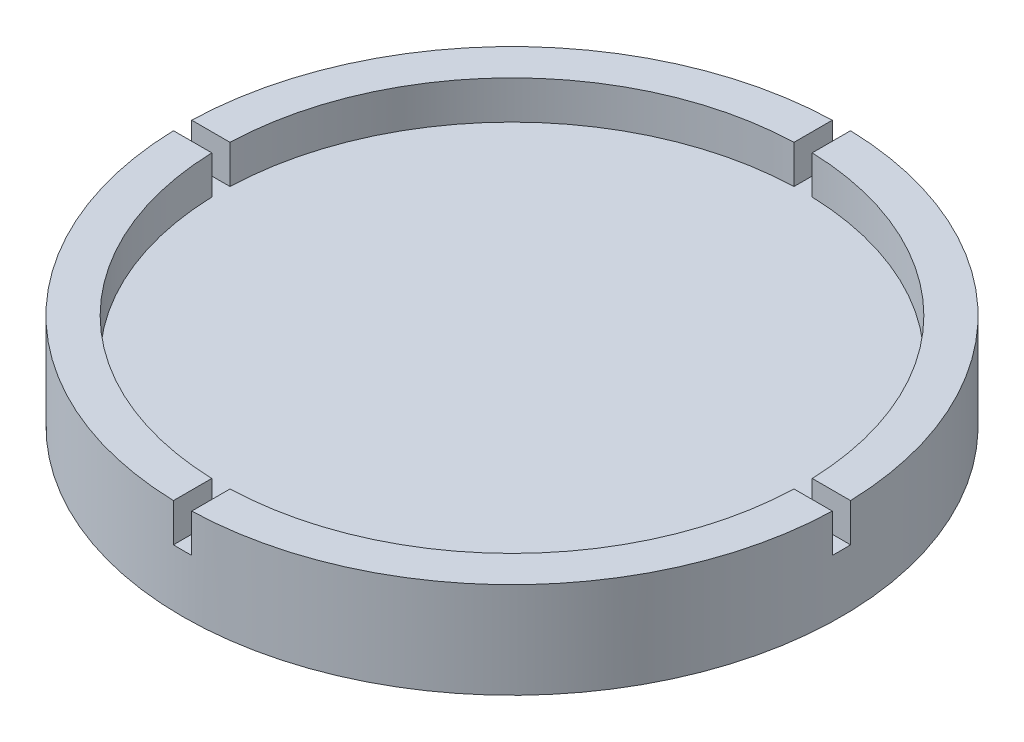
ISO-10303-21;
HEADER;
FILE_DESCRIPTION(('STEP AP214'),'2;1');
FILE_NAME('part.step','',(''),(''),'','','');
FILE_SCHEMA(('AUTOMOTIVE_DESIGN { 1 0 10303 214 1 1 1 1 }'));
ENDSEC;
DATA;
#1=APPLICATION_CONTEXT('core data for automotive mechanical design processes');
#2=APPLICATION_PROTOCOL_DEFINITION('international standard','automotive_design',2000,#1);
#3=PRODUCT_CONTEXT('',#1,'mechanical');
#4=PRODUCT('Part','Part','',(#3));
#5=PRODUCT_RELATED_PRODUCT_CATEGORY('part','',(#4));
#6=PRODUCT_DEFINITION_FORMATION('','',#4);
#7=PRODUCT_DEFINITION_CONTEXT('part definition',#1,'design');
#8=PRODUCT_DEFINITION('design','',#6,#7);
#9=PRODUCT_DEFINITION_SHAPE('','',#8);
#10=(LENGTH_UNIT() NAMED_UNIT(*) SI_UNIT(.MILLI.,.METRE.));
#11=(NAMED_UNIT(*) PLANE_ANGLE_UNIT() SI_UNIT($,.RADIAN.));
#12=(NAMED_UNIT(*) SI_UNIT($,.STERADIAN.) SOLID_ANGLE_UNIT());
#13=UNCERTAINTY_MEASURE_WITH_UNIT(LENGTH_MEASURE(1.E-05),#10,'distance_accuracy_value','');
#14=(GEOMETRIC_REPRESENTATION_CONTEXT(3) GLOBAL_UNCERTAINTY_ASSIGNED_CONTEXT((#13)) GLOBAL_UNIT_ASSIGNED_CONTEXT((#10,
#11,#12)) REPRESENTATION_CONTEXT('',''));
#15=CARTESIAN_POINT('',(0.,0.,0.));
#16=DIRECTION('',(0.,0.,1.));
#17=DIRECTION('',(1.,0.,0.));
#18=AXIS2_PLACEMENT_3D('',#15,#16,#17);
#19=CARTESIAN_POINT('',(0.,25.,0.));
#20=DIRECTION('',(0.,-1.,0.));
#21=DIRECTION('',(0.,0.,-1.));
#22=AXIS2_PLACEMENT_3D('',#19,#20,#21);
#23=PLANE('',#22);
#24=CARTESIAN_POINT('',(0.,25.,0.));
#25=DIRECTION('',(0.,-1.,0.));
#26=DIRECTION('',(0.,0.,-1.));
#27=AXIS2_PLACEMENT_3D('',#24,#25,#26);
#28=CIRCLE('',#27,86.);
#29=CARTESIAN_POINT('',(2.38,25.,-85.9670611339017));
#30=VERTEX_POINT('',#29);
#31=CARTESIAN_POINT('',(85.9670611339017,25.,-2.38));
#32=VERTEX_POINT('',#31);
#33=EDGE_CURVE('E177',#30,#32,#28,.T.);
#34=ORIENTED_EDGE('',*,*,#33,.F.);
#35=DIRECTION('',(0.,0.,-1.));
#36=VECTOR('',#35,1.);
#37=CARTESIAN_POINT('',(2.38,25.,-86.));
#38=LINE('',#37,#36);
#39=CARTESIAN_POINT('',(2.38,25.,-75.9627250696024));
#40=VERTEX_POINT('',#39);
#41=EDGE_CURVE('E327',#40,#30,#38,.T.);
#42=ORIENTED_EDGE('',*,*,#41,.F.);
#43=CARTESIAN_POINT('',(0.,25.,0.));
#44=DIRECTION('',(0.,-1.,0.));
#45=DIRECTION('',(0.,0.,-1.));
#46=AXIS2_PLACEMENT_3D('',#43,#44,#45);
#47=CIRCLE('',#46,76.);
#48=CARTESIAN_POINT('',(75.9627250696024,25.,-2.38));
#49=VERTEX_POINT('',#48);
#50=EDGE_CURVE('E179',#40,#49,#47,.T.);
#51=ORIENTED_EDGE('',*,*,#50,.T.);
#52=DIRECTION('',(-1.,0.,0.));
#53=VECTOR('',#52,1.);
#54=CARTESIAN_POINT('',(86.,25.,-2.38));
#55=LINE('',#54,#53);
#56=EDGE_CURVE('E164',#32,#49,#55,.T.);
#57=ORIENTED_EDGE('',*,*,#56,.F.);
#58=EDGE_LOOP('',(#34,#42,#51,#57));
#59=FACE_BOUND('',#58,.T.);
#60=ADVANCED_FACE('F45',(#59),#23,.F.);
#61=CARTESIAN_POINT('',(-2.37999999999998,25.,85.9670611339017));
#62=VERTEX_POINT('',#61);
#63=CARTESIAN_POINT('',(-85.9670611339017,25.,2.38));
#64=VERTEX_POINT('',#63);
#65=EDGE_CURVE('E200',#62,#64,#28,.T.);
#66=ORIENTED_EDGE('',*,*,#65,.F.);
#67=DIRECTION('',(0.,0.,1.));
#68=VECTOR('',#67,1.);
#69=CARTESIAN_POINT('',(-2.37999999999998,25.,74.8175510394926));
#70=LINE('',#69,#68);
#71=CARTESIAN_POINT('',(-2.37999999999998,25.,75.9627250696024));
#72=VERTEX_POINT('',#71);
#73=EDGE_CURVE('E318',#72,#62,#70,.T.);
#74=ORIENTED_EDGE('',*,*,#73,.F.);
#75=CARTESIAN_POINT('',(-75.9627250696024,25.,2.38));
#76=VERTEX_POINT('',#75);
#77=EDGE_CURVE('E259',#72,#76,#47,.T.);
#78=ORIENTED_EDGE('',*,*,#77,.T.);
#79=DIRECTION('',(1.,0.,0.));
#80=VECTOR('',#79,1.);
#81=CARTESIAN_POINT('',(-75.2220834904902,25.,2.38));
#82=LINE('',#81,#80);
#83=EDGE_CURVE('E309',#64,#76,#82,.T.);
#84=ORIENTED_EDGE('',*,*,#83,.F.);
#85=EDGE_LOOP('',(#66,#74,#78,#84));
#86=FACE_BOUND('',#85,.T.);
#87=ADVANCED_FACE('F354',(#86),#23,.F.);
#88=CARTESIAN_POINT('',(-75.9627250696024,25.,-2.38));
#89=VERTEX_POINT('',#88);
#90=CARTESIAN_POINT('',(-2.38,25.,-75.9627250696024));
#91=VERTEX_POINT('',#90);
#92=EDGE_CURVE('E217',#89,#91,#47,.T.);
#93=ORIENTED_EDGE('',*,*,#92,.T.);
#94=DIRECTION('',(0.,0.,1.));
#95=VECTOR('',#94,1.);
#96=CARTESIAN_POINT('',(-2.38,25.,-74.1398602696469));
#97=LINE('',#96,#95);
#98=CARTESIAN_POINT('',(-2.38,25.,-85.9670611339017));
#99=VERTEX_POINT('',#98);
#100=EDGE_CURVE('E256',#99,#91,#97,.T.);
#101=ORIENTED_EDGE('',*,*,#100,.F.);
#102=CARTESIAN_POINT('',(-85.9670611339017,25.,-2.38));
#103=VERTEX_POINT('',#102);
#104=EDGE_CURVE('E193',#103,#99,#28,.T.);
#105=ORIENTED_EDGE('',*,*,#104,.F.);
#106=DIRECTION('',(-1.,0.,0.));
#107=VECTOR('',#106,1.);
#108=CARTESIAN_POINT('',(-86.,25.,-2.38));
#109=LINE('',#108,#107);
#110=EDGE_CURVE('E257',#89,#103,#109,.T.);
#111=ORIENTED_EDGE('',*,*,#110,.F.);
#112=EDGE_LOOP('',(#93,#101,#105,#111));
#113=FACE_BOUND('',#112,.T.);
#114=ADVANCED_FACE('F255',(#113),#23,.F.);
#115=CARTESIAN_POINT('',(0.,25.,0.));
#116=DIRECTION('',(0.,-1.,0.));
#117=DIRECTION('',(0.,0.,-1.));
#118=AXIS2_PLACEMENT_3D('',#115,#116,#117);
#119=CYLINDRICAL_SURFACE('',#118,76.);
#120=ORIENTED_EDGE('',*,*,#50,.F.);
#121=DIRECTION('',(0.,-1.,0.));
#122=VECTOR('',#121,1.);
#123=CARTESIAN_POINT('',(2.38,25.,-75.9627250696024));
#124=LINE('',#123,#122);
#125=CARTESIAN_POINT('',(2.38,15.,-75.9627250696024));
#126=VERTEX_POINT('',#125);
#127=EDGE_CURVE('E12',#40,#126,#124,.T.);
#128=ORIENTED_EDGE('',*,*,#127,.T.);
#129=CARTESIAN_POINT('',(0.,15.,0.));
#130=DIRECTION('',(0.,1.,0.));
#131=DIRECTION('',(0.,0.,1.));
#132=AXIS2_PLACEMENT_3D('',#129,#130,#131);
#133=CIRCLE('',#132,76.);
#134=CARTESIAN_POINT('',(75.9627250696024,15.,-2.38));
#135=VERTEX_POINT('',#134);
#136=EDGE_CURVE('E222',#135,#126,#133,.T.);
#137=ORIENTED_EDGE('',*,*,#136,.F.);
#138=DIRECTION('',(0.,-1.,0.));
#139=VECTOR('',#138,1.);
#140=CARTESIAN_POINT('',(75.9627250696024,25.,-2.38));
#141=LINE('',#140,#139);
#142=EDGE_CURVE('E221',#135,#49,#141,.F.);
#143=ORIENTED_EDGE('',*,*,#142,.T.);
#144=EDGE_LOOP('',(#120,#128,#137,#143));
#145=FACE_BOUND('',#144,.T.);
#146=ADVANCED_FACE('F342',(#145),#119,.F.);
#147=ORIENTED_EDGE('',*,*,#77,.F.);
#148=DIRECTION('',(0.,-1.,0.));
#149=VECTOR('',#148,1.);
#150=CARTESIAN_POINT('',(-2.37999999999998,25.,75.9627250696024));
#151=LINE('',#150,#149);
#152=CARTESIAN_POINT('',(-2.37999999999998,15.,75.9627250696024));
#153=VERTEX_POINT('',#152);
#154=EDGE_CURVE('E241',#72,#153,#151,.T.);
#155=ORIENTED_EDGE('',*,*,#154,.T.);
#156=CARTESIAN_POINT('',(-75.9627250696024,15.,2.38));
#157=VERTEX_POINT('',#156);
#158=EDGE_CURVE('E190',#157,#153,#133,.T.);
#159=ORIENTED_EDGE('',*,*,#158,.F.);
#160=DIRECTION('',(0.,-1.,0.));
#161=VECTOR('',#160,1.);
#162=CARTESIAN_POINT('',(-75.9627250696024,25.,2.38));
#163=LINE('',#162,#161);
#164=EDGE_CURVE('E229',#157,#76,#163,.F.);
#165=ORIENTED_EDGE('',*,*,#164,.T.);
#166=EDGE_LOOP('',(#147,#155,#159,#165));
#167=FACE_BOUND('',#166,.T.);
#168=ADVANCED_FACE('F358',(#167),#119,.F.);
#169=CARTESIAN_POINT('',(-2.38,15.,-75.9627250696024));
#170=VERTEX_POINT('',#169);
#171=CARTESIAN_POINT('',(-75.9627250696024,15.,-2.38));
#172=VERTEX_POINT('',#171);
#173=EDGE_CURVE('E196',#170,#172,#133,.T.);
#174=ORIENTED_EDGE('',*,*,#173,.F.);
#175=DIRECTION('',(0.,-1.,0.));
#176=VECTOR('',#175,1.);
#177=CARTESIAN_POINT('',(-2.38,25.,-75.9627250696024));
#178=LINE('',#177,#176);
#179=EDGE_CURVE('E54',#170,#91,#178,.F.);
#180=ORIENTED_EDGE('',*,*,#179,.T.);
#181=ORIENTED_EDGE('',*,*,#92,.F.);
#182=DIRECTION('',(0.,-1.,0.));
#183=VECTOR('',#182,1.);
#184=CARTESIAN_POINT('',(-75.9627250696024,25.,-2.38));
#185=LINE('',#184,#183);
#186=EDGE_CURVE('E233',#89,#172,#185,.T.);
#187=ORIENTED_EDGE('',*,*,#186,.T.);
#188=EDGE_LOOP('',(#174,#180,#181,#187));
#189=FACE_BOUND('',#188,.T.);
#190=ADVANCED_FACE('F250',(#189),#119,.F.);
#191=CARTESIAN_POINT('',(0.,15.,0.));
#192=DIRECTION('',(0.,1.,0.));
#193=DIRECTION('',(0.,0.,1.));
#194=AXIS2_PLACEMENT_3D('',#191,#192,#193);
#195=PLANE('',#194);
#196=ORIENTED_EDGE('',*,*,#136,.T.);
#197=DIRECTION('',(0.,0.,-1.));
#198=VECTOR('',#197,1.);
#199=CARTESIAN_POINT('',(2.38,15.,-86.));
#200=LINE('',#199,#198);
#201=CARTESIAN_POINT('',(2.38,15.,-85.9670611339017));
#202=VERTEX_POINT('',#201);
#203=EDGE_CURVE('E295',#126,#202,#200,.T.);
#204=ORIENTED_EDGE('',*,*,#203,.T.);
#205=CARTESIAN_POINT('',(0.,15.,0.));
#206=DIRECTION('',(0.,-1.,0.));
#207=DIRECTION('',(0.,0.,-1.));
#208=AXIS2_PLACEMENT_3D('',#205,#206,#207);
#209=CIRCLE('',#208,86.);
#210=CARTESIAN_POINT('',(-2.38,15.,-85.9670611339017));
#211=VERTEX_POINT('',#210);
#212=EDGE_CURVE('E268',#202,#211,#209,.F.);
#213=ORIENTED_EDGE('',*,*,#212,.T.);
#214=DIRECTION('',(0.,0.,1.));
#215=VECTOR('',#214,1.);
#216=CARTESIAN_POINT('',(-2.38,15.,-74.1398602696469));
#217=LINE('',#216,#215);
#218=EDGE_CURVE('E68',#211,#170,#217,.T.);
#219=ORIENTED_EDGE('',*,*,#218,.T.);
#220=ORIENTED_EDGE('',*,*,#173,.T.);
#221=DIRECTION('',(-1.,0.,0.));
#222=VECTOR('',#221,1.);
#223=CARTESIAN_POINT('',(-86.,15.,-2.38));
#224=LINE('',#223,#222);
#225=CARTESIAN_POINT('',(-85.9670611339017,15.,-2.38));
#226=VERTEX_POINT('',#225);
#227=EDGE_CURVE('E181',#172,#226,#224,.T.);
#228=ORIENTED_EDGE('',*,*,#227,.T.);
#229=CARTESIAN_POINT('',(0.,15.,0.));
#230=DIRECTION('',(0.,-1.,0.));
#231=DIRECTION('',(0.,0.,-1.));
#232=AXIS2_PLACEMENT_3D('',#229,#230,#231);
#233=CIRCLE('',#232,86.);
#234=CARTESIAN_POINT('',(-85.9670611339017,15.,2.38));
#235=VERTEX_POINT('',#234);
#236=EDGE_CURVE('E287',#226,#235,#233,.F.);
#237=ORIENTED_EDGE('',*,*,#236,.T.);
#238=DIRECTION('',(1.,0.,0.));
#239=VECTOR('',#238,1.);
#240=CARTESIAN_POINT('',(-75.2220834904902,15.,2.38));
#241=LINE('',#240,#239);
#242=EDGE_CURVE('E61',#235,#157,#241,.T.);
#243=ORIENTED_EDGE('',*,*,#242,.T.);
#244=ORIENTED_EDGE('',*,*,#158,.T.);
#245=DIRECTION('',(0.,0.,1.));
#246=VECTOR('',#245,1.);
#247=CARTESIAN_POINT('',(-2.37999999999998,15.,74.8175510394926));
#248=LINE('',#247,#246);
#249=CARTESIAN_POINT('',(-2.37999999999998,15.,85.9670611339017));
#250=VERTEX_POINT('',#249);
#251=EDGE_CURVE('E312',#153,#250,#248,.T.);
#252=ORIENTED_EDGE('',*,*,#251,.T.);
#253=CARTESIAN_POINT('',(0.,15.,0.));
#254=DIRECTION('',(0.,1.,0.));
#255=DIRECTION('',(0.,0.,1.));
#256=AXIS2_PLACEMENT_3D('',#253,#254,#255);
#257=CIRCLE('',#256,86.);
#258=CARTESIAN_POINT('',(2.38000000000002,15.,85.9670611339017));
#259=VERTEX_POINT('',#258);
#260=EDGE_CURVE('E278',#259,#250,#257,.F.);
#261=ORIENTED_EDGE('',*,*,#260,.F.);
#262=DIRECTION('',(0.,0.,-1.));
#263=VECTOR('',#262,1.);
#264=CARTESIAN_POINT('',(2.38000000000002,15.,86.));
#265=LINE('',#264,#263);
#266=CARTESIAN_POINT('',(2.38000000000002,15.,75.9627250696024));
#267=VERTEX_POINT('',#266);
#268=EDGE_CURVE('E315',#259,#267,#265,.T.);
#269=ORIENTED_EDGE('',*,*,#268,.T.);
#270=CARTESIAN_POINT('',(75.9627250696024,15.,2.38));
#271=VERTEX_POINT('',#270);
#272=EDGE_CURVE('E198',#267,#271,#133,.T.);
#273=ORIENTED_EDGE('',*,*,#272,.T.);
#274=DIRECTION('',(1.,0.,0.));
#275=VECTOR('',#274,1.);
#276=CARTESIAN_POINT('',(75.1618896776529,15.,2.38));
#277=LINE('',#276,#275);
#278=CARTESIAN_POINT('',(85.9670611339017,15.,2.38));
#279=VERTEX_POINT('',#278);
#280=EDGE_CURVE('E298',#271,#279,#277,.T.);
#281=ORIENTED_EDGE('',*,*,#280,.T.);
#282=CARTESIAN_POINT('',(0.,15.,0.));
#283=DIRECTION('',(0.,1.,0.));
#284=DIRECTION('',(0.,0.,1.));
#285=AXIS2_PLACEMENT_3D('',#282,#283,#284);
#286=CIRCLE('',#285,86.);
#287=CARTESIAN_POINT('',(85.9670611339017,15.,-2.38));
#288=VERTEX_POINT('',#287);
#289=EDGE_CURVE('E171',#288,#279,#286,.F.);
#290=ORIENTED_EDGE('',*,*,#289,.F.);
#291=DIRECTION('',(-1.,0.,0.));
#292=VECTOR('',#291,1.);
#293=CARTESIAN_POINT('',(86.,15.,-2.38));
#294=LINE('',#293,#292);
#295=EDGE_CURVE('E166',#288,#135,#294,.T.);
#296=ORIENTED_EDGE('',*,*,#295,.T.);
#297=EDGE_LOOP('',(#196,#204,#213,#219,#220,#228,#237,#243,#244,#252,#261,#269,#273,#281,#290,#296));
#298=FACE_BOUND('',#297,.T.);
#299=ADVANCED_FACE('F337',(#298),#195,.T.);
#300=CARTESIAN_POINT('',(0.,25.,0.));
#301=DIRECTION('',(0.,-1.,0.));
#302=DIRECTION('',(0.,0.,-1.));
#303=AXIS2_PLACEMENT_3D('',#300,#301,#302);
#304=CYLINDRICAL_SURFACE('',#303,86.);
#305=DIRECTION('',(0.,-1.,0.));
#306=VECTOR('',#305,1.);
#307=CARTESIAN_POINT('',(2.38,25.,-85.9670611339017));
#308=LINE('',#307,#306);
#309=EDGE_CURVE('E188',#30,#202,#308,.T.);
#310=ORIENTED_EDGE('',*,*,#309,.F.);
#311=ORIENTED_EDGE('',*,*,#33,.T.);
#312=DIRECTION('',(0.,-1.,0.));
#313=VECTOR('',#312,1.);
#314=CARTESIAN_POINT('',(85.9670611339017,25.,-2.38));
#315=LINE('',#314,#313);
#316=EDGE_CURVE('E160',#288,#32,#315,.F.);
#317=ORIENTED_EDGE('',*,*,#316,.F.);
#318=ORIENTED_EDGE('',*,*,#289,.T.);
#319=DIRECTION('',(0.,-1.,0.));
#320=VECTOR('',#319,1.);
#321=CARTESIAN_POINT('',(85.9670611339017,25.,2.38));
#322=LINE('',#321,#320);
#323=CARTESIAN_POINT('',(85.9670611339017,25.,2.38));
#324=VERTEX_POINT('',#323);
#325=EDGE_CURVE('E170',#324,#279,#322,.T.);
#326=ORIENTED_EDGE('',*,*,#325,.F.);
#327=CARTESIAN_POINT('',(2.38000000000002,25.,85.9670611339017));
#328=VERTEX_POINT('',#327);
#329=EDGE_CURVE('E191',#324,#328,#28,.T.);
#330=ORIENTED_EDGE('',*,*,#329,.T.);
#331=DIRECTION('',(0.,-1.,0.));
#332=VECTOR('',#331,1.);
#333=CARTESIAN_POINT('',(2.38000000000002,25.,85.9670611339017));
#334=LINE('',#333,#332);
#335=EDGE_CURVE('E275',#259,#328,#334,.F.);
#336=ORIENTED_EDGE('',*,*,#335,.F.);
#337=ORIENTED_EDGE('',*,*,#260,.T.);
#338=DIRECTION('',(0.,-1.,0.));
#339=VECTOR('',#338,1.);
#340=CARTESIAN_POINT('',(-2.37999999999998,25.,85.9670611339017));
#341=LINE('',#340,#339);
#342=EDGE_CURVE('E271',#62,#250,#341,.T.);
#343=ORIENTED_EDGE('',*,*,#342,.F.);
#344=ORIENTED_EDGE('',*,*,#65,.T.);
#345=DIRECTION('',(0.,-1.,0.));
#346=VECTOR('',#345,1.);
#347=CARTESIAN_POINT('',(-85.9670611339017,25.,2.38));
#348=LINE('',#347,#346);
#349=EDGE_CURVE('E284',#235,#64,#348,.F.);
#350=ORIENTED_EDGE('',*,*,#349,.F.);
#351=ORIENTED_EDGE('',*,*,#236,.F.);
#352=DIRECTION('',(0.,-1.,0.));
#353=VECTOR('',#352,1.);
#354=CARTESIAN_POINT('',(-85.9670611339017,25.,-2.38));
#355=LINE('',#354,#353);
#356=EDGE_CURVE('E281',#103,#226,#355,.T.);
#357=ORIENTED_EDGE('',*,*,#356,.F.);
#358=ORIENTED_EDGE('',*,*,#104,.T.);
#359=DIRECTION('',(0.,-1.,0.));
#360=VECTOR('',#359,1.);
#361=CARTESIAN_POINT('',(-2.38,25.,-85.9670611339017));
#362=LINE('',#361,#360);
#363=EDGE_CURVE('E263',#211,#99,#362,.F.);
#364=ORIENTED_EDGE('',*,*,#363,.F.);
#365=ORIENTED_EDGE('',*,*,#212,.F.);
#366=EDGE_LOOP('',(#310,#311,#317,#318,#326,#330,#336,#337,#343,#344,#350,#351,#357,#358,#364,#365));
#367=FACE_BOUND('',#366,.T.);
#368=CARTESIAN_POINT('',(0.,0.,0.));
#369=DIRECTION('',(0.,-1.,0.));
#370=DIRECTION('',(0.,0.,-1.));
#371=AXIS2_PLACEMENT_3D('',#368,#369,#370);
#372=CIRCLE('',#371,86.);
#373=CARTESIAN_POINT('',(0.,0.,-86.));
#374=VERTEX_POINT('',#373);
#375=EDGE_CURVE('E205',#374,#374,#372,.T.);
#376=ORIENTED_EDGE('',*,*,#375,.F.);
#377=EDGE_LOOP('',(#376));
#378=FACE_BOUND('',#377,.T.);
#379=ADVANCED_FACE('F185',(#367,#378),#304,.T.);
#380=CARTESIAN_POINT('',(75.9627250696024,25.,2.38));
#381=VERTEX_POINT('',#380);
#382=CARTESIAN_POINT('',(2.38000000000002,25.,75.9627250696024));
#383=VERTEX_POINT('',#382);
#384=EDGE_CURVE('E216',#381,#383,#47,.T.);
#385=ORIENTED_EDGE('',*,*,#384,.T.);
#386=DIRECTION('',(0.,0.,-1.));
#387=VECTOR('',#386,1.);
#388=CARTESIAN_POINT('',(2.38000000000002,25.,86.));
#389=LINE('',#388,#387);
#390=EDGE_CURVE('E322',#328,#383,#389,.T.);
#391=ORIENTED_EDGE('',*,*,#390,.F.);
#392=ORIENTED_EDGE('',*,*,#329,.F.);
#393=DIRECTION('',(1.,0.,0.));
#394=VECTOR('',#393,1.);
#395=CARTESIAN_POINT('',(75.1618896776529,25.,2.38));
#396=LINE('',#395,#394);
#397=EDGE_CURVE('E182',#381,#324,#396,.T.);
#398=ORIENTED_EDGE('',*,*,#397,.F.);
#399=EDGE_LOOP('',(#385,#391,#392,#398));
#400=FACE_BOUND('',#399,.T.);
#401=ADVANCED_FACE('F372',(#400),#23,.F.);
#402=ORIENTED_EDGE('',*,*,#272,.F.);
#403=DIRECTION('',(0.,-1.,0.));
#404=VECTOR('',#403,1.);
#405=CARTESIAN_POINT('',(2.38000000000002,25.,75.9627250696024));
#406=LINE('',#405,#404);
#407=EDGE_CURVE('E237',#267,#383,#406,.F.);
#408=ORIENTED_EDGE('',*,*,#407,.T.);
#409=ORIENTED_EDGE('',*,*,#384,.F.);
#410=DIRECTION('',(0.,-1.,0.));
#411=VECTOR('',#410,1.);
#412=CARTESIAN_POINT('',(75.9627250696024,25.,2.38));
#413=LINE('',#412,#411);
#414=EDGE_CURVE('E225',#381,#271,#413,.T.);
#415=ORIENTED_EDGE('',*,*,#414,.T.);
#416=EDGE_LOOP('',(#402,#408,#409,#415));
#417=FACE_BOUND('',#416,.T.);
#418=ADVANCED_FACE('F378',(#417),#119,.F.);
#419=CARTESIAN_POINT('',(0.,0.,0.));
#420=DIRECTION('',(0.,1.,0.));
#421=DIRECTION('',(0.,0.,1.));
#422=AXIS2_PLACEMENT_3D('',#419,#420,#421);
#423=PLANE('',#422);
#424=ORIENTED_EDGE('',*,*,#375,.T.);
#425=EDGE_LOOP('',(#424));
#426=FACE_BOUND('',#425,.T.);
#427=ADVANCED_FACE('F47',(#426),#423,.F.);
#428=CARTESIAN_POINT('',(75.1618896776529,15.,2.38));
#429=DIRECTION('',(0.,0.,1.));
#430=DIRECTION('',(1.,0.,0.));
#431=AXIS2_PLACEMENT_3D('',#428,#429,#430);
#432=PLANE('',#431);
#433=ORIENTED_EDGE('',*,*,#325,.T.);
#434=ORIENTED_EDGE('',*,*,#280,.F.);
#435=ORIENTED_EDGE('',*,*,#414,.F.);
#436=ORIENTED_EDGE('',*,*,#397,.T.);
#437=EDGE_LOOP('',(#433,#434,#435,#436));
#438=FACE_BOUND('',#437,.T.);
#439=ADVANCED_FACE('F380',(#438),#432,.F.);
#440=CARTESIAN_POINT('',(86.,15.,-2.38));
#441=DIRECTION('',(0.,0.,-1.));
#442=DIRECTION('',(-1.,0.,0.));
#443=AXIS2_PLACEMENT_3D('',#440,#441,#442);
#444=PLANE('',#443);
#445=ORIENTED_EDGE('',*,*,#316,.T.);
#446=ORIENTED_EDGE('',*,*,#56,.T.);
#447=ORIENTED_EDGE('',*,*,#142,.F.);
#448=ORIENTED_EDGE('',*,*,#295,.F.);
#449=EDGE_LOOP('',(#445,#446,#447,#448));
#450=FACE_BOUND('',#449,.T.);
#451=ADVANCED_FACE('F162',(#450),#444,.F.);
#452=CARTESIAN_POINT('',(-86.,15.,-2.38));
#453=DIRECTION('',(0.,0.,-1.));
#454=DIRECTION('',(-1.,0.,0.));
#455=AXIS2_PLACEMENT_3D('',#452,#453,#454);
#456=PLANE('',#455);
#457=ORIENTED_EDGE('',*,*,#356,.T.);
#458=ORIENTED_EDGE('',*,*,#227,.F.);
#459=ORIENTED_EDGE('',*,*,#186,.F.);
#460=ORIENTED_EDGE('',*,*,#110,.T.);
#461=EDGE_LOOP('',(#457,#458,#459,#460));
#462=FACE_BOUND('',#461,.T.);
#463=ADVANCED_FACE('F387',(#462),#456,.F.);
#464=CARTESIAN_POINT('',(-75.2220834904902,15.,2.38));
#465=DIRECTION('',(0.,0.,1.));
#466=DIRECTION('',(1.,0.,0.));
#467=AXIS2_PLACEMENT_3D('',#464,#465,#466);
#468=PLANE('',#467);
#469=ORIENTED_EDGE('',*,*,#349,.T.);
#470=ORIENTED_EDGE('',*,*,#83,.T.);
#471=ORIENTED_EDGE('',*,*,#164,.F.);
#472=ORIENTED_EDGE('',*,*,#242,.F.);
#473=EDGE_LOOP('',(#469,#470,#471,#472));
#474=FACE_BOUND('',#473,.T.);
#475=ADVANCED_FACE('F352',(#474),#468,.F.);
#476=CARTESIAN_POINT('',(-2.37999999999998,15.,74.8175510394926));
#477=DIRECTION('',(-1.,0.,0.));
#478=DIRECTION('',(0.,0.,1.));
#479=AXIS2_PLACEMENT_3D('',#476,#477,#478);
#480=PLANE('',#479);
#481=ORIENTED_EDGE('',*,*,#342,.T.);
#482=ORIENTED_EDGE('',*,*,#251,.F.);
#483=ORIENTED_EDGE('',*,*,#154,.F.);
#484=ORIENTED_EDGE('',*,*,#73,.T.);
#485=EDGE_LOOP('',(#481,#482,#483,#484));
#486=FACE_BOUND('',#485,.T.);
#487=ADVANCED_FACE('F362',(#486),#480,.F.);
#488=CARTESIAN_POINT('',(2.38000000000002,15.,86.));
#489=DIRECTION('',(1.,0.,0.));
#490=DIRECTION('',(0.,0.,-1.));
#491=AXIS2_PLACEMENT_3D('',#488,#489,#490);
#492=PLANE('',#491);
#493=ORIENTED_EDGE('',*,*,#335,.T.);
#494=ORIENTED_EDGE('',*,*,#390,.T.);
#495=ORIENTED_EDGE('',*,*,#407,.F.);
#496=ORIENTED_EDGE('',*,*,#268,.F.);
#497=EDGE_LOOP('',(#493,#494,#495,#496));
#498=FACE_BOUND('',#497,.T.);
#499=ADVANCED_FACE('F368',(#498),#492,.F.);
#500=CARTESIAN_POINT('',(2.38,15.,-86.));
#501=DIRECTION('',(1.,0.,0.));
#502=DIRECTION('',(0.,0.,-1.));
#503=AXIS2_PLACEMENT_3D('',#500,#501,#502);
#504=PLANE('',#503);
#505=ORIENTED_EDGE('',*,*,#309,.T.);
#506=ORIENTED_EDGE('',*,*,#203,.F.);
#507=ORIENTED_EDGE('',*,*,#127,.F.);
#508=ORIENTED_EDGE('',*,*,#41,.T.);
#509=EDGE_LOOP('',(#505,#506,#507,#508));
#510=FACE_BOUND('',#509,.T.);
#511=ADVANCED_FACE('F340',(#510),#504,.F.);
#512=CARTESIAN_POINT('',(-2.38,15.,-74.1398602696469));
#513=DIRECTION('',(-1.,0.,0.));
#514=DIRECTION('',(0.,0.,1.));
#515=AXIS2_PLACEMENT_3D('',#512,#513,#514);
#516=PLANE('',#515);
#517=ORIENTED_EDGE('',*,*,#363,.T.);
#518=ORIENTED_EDGE('',*,*,#100,.T.);
#519=ORIENTED_EDGE('',*,*,#179,.F.);
#520=ORIENTED_EDGE('',*,*,#218,.F.);
#521=EDGE_LOOP('',(#517,#518,#519,#520));
#522=FACE_BOUND('',#521,.T.);
#523=ADVANCED_FACE('F510',(#522),#516,.F.);
#524=CLOSED_SHELL('',(#60,#87,#114,#146,#168,#190,#299,#379,#401,#418,#427,#439,#451,#463,#475,
#487,#499,#511,#523));
#525=MANIFOLD_SOLID_BREP('B2',#524);
#526=ADVANCED_BREP_SHAPE_REPRESENTATION('',(#18,#525),#14);
#527=SHAPE_DEFINITION_REPRESENTATION(#9,#526);
ENDSEC;
END-ISO-10303-21;
